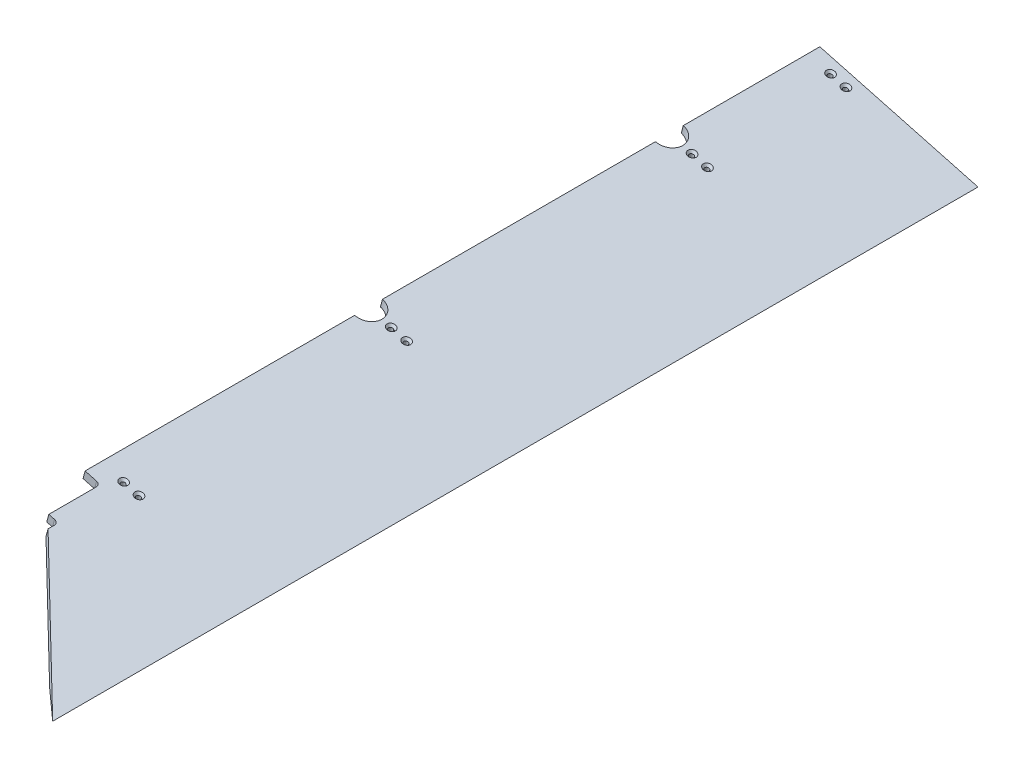
ISO-10303-21;
HEADER;
FILE_DESCRIPTION(('STEP AP214'),'2;1');
FILE_NAME('part.step','',(''),(''),'','','');
FILE_SCHEMA(('AUTOMOTIVE_DESIGN { 1 0 10303 214 1 1 1 1 }'));
ENDSEC;
DATA;
#1=APPLICATION_CONTEXT('core data for automotive mechanical design processes');
#2=APPLICATION_PROTOCOL_DEFINITION('international standard','automotive_design',2000,#1);
#3=PRODUCT_CONTEXT('',#1,'mechanical');
#4=PRODUCT('Part','Part','',(#3));
#5=PRODUCT_RELATED_PRODUCT_CATEGORY('part','',(#4));
#6=PRODUCT_DEFINITION_FORMATION('','',#4);
#7=PRODUCT_DEFINITION_CONTEXT('part definition',#1,'design');
#8=PRODUCT_DEFINITION('design','',#6,#7);
#9=PRODUCT_DEFINITION_SHAPE('','',#8);
#10=(LENGTH_UNIT() NAMED_UNIT(*) SI_UNIT(.MILLI.,.METRE.));
#11=(NAMED_UNIT(*) PLANE_ANGLE_UNIT() SI_UNIT($,.RADIAN.));
#12=(NAMED_UNIT(*) SI_UNIT($,.STERADIAN.) SOLID_ANGLE_UNIT());
#13=UNCERTAINTY_MEASURE_WITH_UNIT(LENGTH_MEASURE(1.E-05),#10,'distance_accuracy_value','');
#14=(GEOMETRIC_REPRESENTATION_CONTEXT(3) GLOBAL_UNCERTAINTY_ASSIGNED_CONTEXT((#13)) GLOBAL_UNIT_ASSIGNED_CONTEXT((#10,
#11,#12)) REPRESENTATION_CONTEXT('',''));
#15=CARTESIAN_POINT('',(0.,0.,0.));
#16=DIRECTION('',(0.,0.,1.));
#17=DIRECTION('',(1.,0.,0.));
#18=AXIS2_PLACEMENT_3D('',#15,#16,#17);
#19=CARTESIAN_POINT('',(25.512001872802,67.770934414059,1479.55));
#20=DIRECTION('',(0.965925826289067,-0.258819045102524,0.));
#21=DIRECTION('',(0.258819045102524,0.965925826289068,0.));
#22=AXIS2_PLACEMENT_3D('',#19,#20,#21);
#23=PLANE('',#22);
#24=DIRECTION('',(0.,0.,-1.));
#25=VECTOR('',#24,1.);
#26=CARTESIAN_POINT('',(22.225,55.5036764201878,1479.55));
#27=LINE('',#26,#25);
#28=CARTESIAN_POINT('',(22.225,55.5036764201878,218.28125));
#29=VERTEX_POINT('',#28);
#30=CARTESIAN_POINT('',(22.225,55.5036764201878,0.));
#31=VERTEX_POINT('',#30);
#32=EDGE_CURVE('E274',#29,#31,#27,.T.);
#33=ORIENTED_EDGE('',*,*,#32,.F.);
#34=DIRECTION('',(0.258819045102524,0.965925826289067,0.));
#35=VECTOR('',#34,1.);
#36=CARTESIAN_POINT('',(8.34908089495289,3.71804131843699,218.28125));
#37=LINE('',#36,#35);
#38=CARTESIAN_POINT('',(25.5120018728021,67.770934414059,218.28125));
#39=VERTEX_POINT('',#38);
#40=EDGE_CURVE('E196',#29,#39,#37,.T.);
#41=ORIENTED_EDGE('',*,*,#40,.T.);
#42=DIRECTION('',(0.,0.,-1.));
#43=VECTOR('',#42,1.);
#44=CARTESIAN_POINT('',(25.512001872802,67.770934414059,1479.55));
#45=LINE('',#44,#43);
#46=CARTESIAN_POINT('',(25.512001872802,67.770934414059,0.));
#47=VERTEX_POINT('',#46);
#48=EDGE_CURVE('E266',#39,#47,#45,.T.);
#49=ORIENTED_EDGE('',*,*,#48,.T.);
#50=DIRECTION('',(-0.258819045102524,-0.965925826289068,0.));
#51=VECTOR('',#50,1.);
#52=CARTESIAN_POINT('',(25.512001872802,67.770934414059,0.));
#53=LINE('',#52,#51);
#54=EDGE_CURVE('E255',#47,#31,#53,.T.);
#55=ORIENTED_EDGE('',*,*,#54,.T.);
#56=EDGE_LOOP('',(#33,#41,#49,#55));
#57=FACE_BOUND('',#56,.T.);
#58=ADVANCED_FACE('F35',(#57),#23,.F.);
#59=CARTESIAN_POINT('',(25.5120018728021,67.770934414059,699.29375));
#60=VERTEX_POINT('',#59);
#61=CARTESIAN_POINT('',(25.512001872802,67.770934414059,262.73125));
#62=VERTEX_POINT('',#61);
#63=EDGE_CURVE('E270',#60,#62,#45,.T.);
#64=ORIENTED_EDGE('',*,*,#63,.T.);
#65=DIRECTION('',(0.258819045102524,0.965925826289067,0.));
#66=VECTOR('',#65,1.);
#67=CARTESIAN_POINT('',(8.34908089495289,3.71804131843699,262.73125));
#68=LINE('',#67,#66);
#69=CARTESIAN_POINT('',(22.225,55.5036764201878,262.73125));
#70=VERTEX_POINT('',#69);
#71=EDGE_CURVE('E193',#62,#70,#68,.F.);
#72=ORIENTED_EDGE('',*,*,#71,.T.);
#73=CARTESIAN_POINT('',(22.225,55.5036764201878,699.29375));
#74=VERTEX_POINT('',#73);
#75=EDGE_CURVE('E278',#74,#70,#27,.T.);
#76=ORIENTED_EDGE('',*,*,#75,.F.);
#77=DIRECTION('',(0.258819045102524,0.965925826289067,0.));
#78=VECTOR('',#77,1.);
#79=CARTESIAN_POINT('',(8.34908089495289,3.718041318437,699.29375));
#80=LINE('',#79,#78);
#81=EDGE_CURVE('E187',#74,#60,#80,.T.);
#82=ORIENTED_EDGE('',*,*,#81,.T.);
#83=EDGE_LOOP('',(#64,#72,#76,#82));
#84=FACE_BOUND('',#83,.T.);
#85=ADVANCED_FACE('F346',(#84),#23,.F.);
#86=CARTESIAN_POINT('',(22.225,55.5036764201878,1174.75));
#87=VERTEX_POINT('',#86);
#88=CARTESIAN_POINT('',(22.225,55.5036764201878,743.74375));
#89=VERTEX_POINT('',#88);
#90=EDGE_CURVE('E275',#87,#89,#27,.T.);
#91=ORIENTED_EDGE('',*,*,#90,.F.);
#92=DIRECTION('',(0.258819045102524,0.965925826289067,0.));
#93=VECTOR('',#92,1.);
#94=CARTESIAN_POINT('',(8.34908089495287,3.71804131843699,1174.75));
#95=LINE('',#94,#93);
#96=CARTESIAN_POINT('',(25.5120018728021,67.770934414059,1174.75));
#97=VERTEX_POINT('',#96);
#98=EDGE_CURVE('E161',#87,#97,#95,.T.);
#99=ORIENTED_EDGE('',*,*,#98,.T.);
#100=CARTESIAN_POINT('',(25.512001872802,67.770934414059,743.74375));
#101=VERTEX_POINT('',#100);
#102=EDGE_CURVE('E267',#97,#101,#45,.T.);
#103=ORIENTED_EDGE('',*,*,#102,.T.);
#104=DIRECTION('',(0.258819045102524,0.965925826289067,0.));
#105=VECTOR('',#104,1.);
#106=CARTESIAN_POINT('',(8.34908089495289,3.718041318437,743.74375));
#107=LINE('',#106,#105);
#108=EDGE_CURVE('E184',#101,#89,#107,.F.);
#109=ORIENTED_EDGE('',*,*,#108,.T.);
#110=EDGE_LOOP('',(#91,#99,#103,#109));
#111=FACE_BOUND('',#110,.T.);
#112=ADVANCED_FACE('F357',(#111),#23,.F.);
#113=CARTESIAN_POINT('',(22.225,55.5036764201878,1479.55));
#114=DIRECTION('',(0.258819045102524,0.965925826289067,0.));
#115=DIRECTION('',(-0.965925826289067,0.258819045102524,0.));
#116=AXIS2_PLACEMENT_3D('',#113,#114,#115);
#117=PLANE('',#116);
#118=CARTESIAN_POINT('',(58.5115491458709,45.7807248804393,721.51875));
#119=DIRECTION('',(0.258819045102524,0.965925826289067,0.));
#120=DIRECTION('',(-0.965925826289067,0.258819045102524,0.));
#121=AXIS2_PLACEMENT_3D('',#118,#119,#120);
#122=CIRCLE('',#121,3.57123999999998);
#123=CARTESIAN_POINT('',(55.0619961979943,46.7050298070713,721.51875));
#124=VERTEX_POINT('',#123);
#125=EDGE_CURVE('E205',#124,#124,#122,.T.);
#126=ORIENTED_EDGE('',*,*,#125,.T.);
#127=EDGE_LOOP('',(#126));
#128=FACE_BOUND('',#127,.T.);
#129=CARTESIAN_POINT('',(83.0460651336132,39.2067211348352,721.51875));
#130=DIRECTION('',(0.258819045102524,0.965925826289067,0.));
#131=DIRECTION('',(-0.965925826289067,0.258819045102524,0.));
#132=AXIS2_PLACEMENT_3D('',#129,#130,#131);
#133=CIRCLE('',#132,3.57123999999998);
#134=CARTESIAN_POINT('',(79.5965121857366,40.1310260614672,721.51875));
#135=VERTEX_POINT('',#134);
#136=EDGE_CURVE('E212',#135,#135,#133,.T.);
#137=ORIENTED_EDGE('',*,*,#136,.T.);
#138=EDGE_LOOP('',(#137));
#139=FACE_BOUND('',#138,.T.);
#140=CARTESIAN_POINT('',(58.5115491458709,45.7807248804393,240.50625));
#141=DIRECTION('',(0.258819045102524,0.965925826289067,0.));
#142=DIRECTION('',(-0.965925826289067,0.258819045102524,0.));
#143=AXIS2_PLACEMENT_3D('',#140,#141,#142);
#144=CIRCLE('',#143,3.57123999999999);
#145=CARTESIAN_POINT('',(55.0619961979943,46.7050298070713,240.50625));
#146=VERTEX_POINT('',#145);
#147=EDGE_CURVE('E219',#146,#146,#144,.T.);
#148=ORIENTED_EDGE('',*,*,#147,.T.);
#149=EDGE_LOOP('',(#148));
#150=FACE_BOUND('',#149,.T.);
#151=CARTESIAN_POINT('',(83.0460651336132,39.2067211348352,240.50625));
#152=DIRECTION('',(0.258819045102524,0.965925826289067,0.));
#153=DIRECTION('',(-0.965925826289067,0.258819045102524,0.));
#154=AXIS2_PLACEMENT_3D('',#151,#152,#153);
#155=CIRCLE('',#154,3.57123999999999);
#156=CARTESIAN_POINT('',(79.5965121857366,40.1310260614672,240.50625));
#157=VERTEX_POINT('',#156);
#158=EDGE_CURVE('E226',#157,#157,#155,.T.);
#159=ORIENTED_EDGE('',*,*,#158,.T.);
#160=EDGE_LOOP('',(#159));
#161=FACE_BOUND('',#160,.T.);
#162=CARTESIAN_POINT('',(58.5115491458709,45.7807248804393,1149.35));
#163=DIRECTION('',(0.258819045102524,0.965925826289067,0.));
#164=DIRECTION('',(-0.965925826289067,0.258819045102524,0.));
#165=AXIS2_PLACEMENT_3D('',#162,#163,#164);
#166=CIRCLE('',#165,3.57124000000009);
#167=CARTESIAN_POINT('',(55.0619961979942,46.7050298070713,1149.35));
#168=VERTEX_POINT('',#167);
#169=EDGE_CURVE('E233',#168,#168,#166,.T.);
#170=ORIENTED_EDGE('',*,*,#169,.T.);
#171=EDGE_LOOP('',(#170));
#172=FACE_BOUND('',#171,.T.);
#173=CARTESIAN_POINT('',(83.0460651336132,39.2067211348352,1149.35));
#174=DIRECTION('',(0.258819045102524,0.965925826289067,0.));
#175=DIRECTION('',(-0.965925826289067,0.258819045102524,0.));
#176=AXIS2_PLACEMENT_3D('',#173,#174,#175);
#177=CIRCLE('',#176,3.57124000000009);
#178=CARTESIAN_POINT('',(79.5965121857365,40.1310260614672,1149.35));
#179=VERTEX_POINT('',#178);
#180=EDGE_CURVE('E240',#179,#179,#177,.T.);
#181=ORIENTED_EDGE('',*,*,#180,.T.);
#182=EDGE_LOOP('',(#181));
#183=FACE_BOUND('',#182,.T.);
#184=CARTESIAN_POINT('',(58.5115491458709,45.7807248804393,19.05));
#185=DIRECTION('',(0.258819045102524,0.965925826289067,0.));
#186=DIRECTION('',(-0.965925826289067,0.258819045102524,0.));
#187=AXIS2_PLACEMENT_3D('',#184,#185,#186);
#188=CIRCLE('',#187,3.57123999999999);
#189=CARTESIAN_POINT('',(55.0619961979943,46.7050298070713,19.05));
#190=VERTEX_POINT('',#189);
#191=EDGE_CURVE('E247',#190,#190,#188,.T.);
#192=ORIENTED_EDGE('',*,*,#191,.T.);
#193=EDGE_LOOP('',(#192));
#194=FACE_BOUND('',#193,.T.);
#195=CARTESIAN_POINT('',(83.0460651336132,39.2067211348352,19.05));
#196=DIRECTION('',(0.258819045102524,0.965925826289067,0.));
#197=DIRECTION('',(-0.965925826289067,0.258819045102524,0.));
#198=AXIS2_PLACEMENT_3D('',#195,#196,#197);
#199=CIRCLE('',#198,3.57123999999999);
#200=CARTESIAN_POINT('',(79.5965121857366,40.1310260614672,19.05));
#201=VERTEX_POINT('',#200);
#202=EDGE_CURVE('E254',#201,#201,#199,.T.);
#203=ORIENTED_EDGE('',*,*,#202,.T.);
#204=EDGE_LOOP('',(#203));
#205=FACE_BOUND('',#204,.T.);
#206=DIRECTION('',(0.,0.,-1.));
#207=VECTOR('',#206,1.);
#208=CARTESIAN_POINT('',(46.7595159877423,48.9296726745837,1479.55));
#209=LINE('',#208,#207);
#210=CARTESIAN_POINT('',(46.7595159877423,48.9296726745837,1257.3));
#211=VERTEX_POINT('',#210);
#212=CARTESIAN_POINT('',(46.7595159877423,48.9296726745837,1181.1));
#213=VERTEX_POINT('',#212);
#214=EDGE_CURVE('E172',#211,#213,#209,.T.);
#215=ORIENTED_EDGE('',*,*,#214,.T.);
#216=CARTESIAN_POINT('',(40.6258869908067,50.5731736109847,1181.1));
#217=DIRECTION('',(0.258819045102524,0.965925826289067,0.));
#218=DIRECTION('',(-0.965925826289067,0.258819045102524,0.));
#219=AXIS2_PLACEMENT_3D('',#216,#217,#218);
#220=CIRCLE('',#219,6.35);
#221=CARTESIAN_POINT('',(40.6258869908067,50.5731736109847,1174.75));
#222=VERTEX_POINT('',#221);
#223=EDGE_CURVE('E305',#213,#222,#220,.T.);
#224=ORIENTED_EDGE('',*,*,#223,.T.);
#225=DIRECTION('',(-0.965925826289067,0.258819045102524,0.));
#226=VECTOR('',#225,1.);
#227=CARTESIAN_POINT('',(22.225,55.5036764201878,1174.75));
#228=LINE('',#227,#226);
#229=EDGE_CURVE('E175',#222,#87,#228,.T.);
#230=ORIENTED_EDGE('',*,*,#229,.T.);
#231=ORIENTED_EDGE('',*,*,#90,.T.);
#232=CARTESIAN_POINT('',(22.225,55.5036764201878,721.51875));
#233=DIRECTION('',(0.258819045102524,0.965925826289067,0.));
#234=DIRECTION('',(-0.965925826289067,0.258819045102524,0.));
#235=AXIS2_PLACEMENT_3D('',#232,#233,#234);
#236=CIRCLE('',#235,22.225);
#237=EDGE_CURVE('E180',#89,#74,#236,.T.);
#238=ORIENTED_EDGE('',*,*,#237,.T.);
#239=ORIENTED_EDGE('',*,*,#75,.T.);
#240=CARTESIAN_POINT('',(22.225,55.5036764201878,240.50625));
#241=DIRECTION('',(0.258819045102524,0.965925826289067,0.));
#242=DIRECTION('',(-0.965925826289067,0.258819045102524,0.));
#243=AXIS2_PLACEMENT_3D('',#240,#241,#242);
#244=CIRCLE('',#243,22.225);
#245=EDGE_CURVE('E190',#70,#29,#244,.T.);
#246=ORIENTED_EDGE('',*,*,#245,.T.);
#247=ORIENTED_EDGE('',*,*,#32,.T.);
#248=DIRECTION('',(0.965925826289067,-0.258819045102524,0.));
#249=VECTOR('',#248,1.);
#250=CARTESIAN_POINT('',(22.225,55.5036764201878,0.));
#251=LINE('',#250,#249);
#252=CARTESIAN_POINT('',(229.367540407001,0.,0.));
#253=VERTEX_POINT('',#252);
#254=EDGE_CURVE('E258',#31,#253,#251,.T.);
#255=ORIENTED_EDGE('',*,*,#254,.T.);
#256=DIRECTION('',(0.,0.,-1.));
#257=VECTOR('',#256,1.);
#258=CARTESIAN_POINT('',(229.367540407001,0.,1479.55));
#259=LINE('',#258,#257);
#260=CARTESIAN_POINT('',(229.367540407001,0.,1435.35154026031));
#261=VERTEX_POINT('',#260);
#262=EDGE_CURVE('E272',#261,#253,#259,.T.);
#263=ORIENTED_EDGE('',*,*,#262,.F.);
#264=DIRECTION('',(-0.706433428546067,0.189288266685271,-0.681998360062496));
#265=VECTOR('',#264,1.);
#266=CARTESIAN_POINT('',(139.865722173839,23.9819399166931,1348.9455311573));
#267=LINE('',#266,#265);
#268=CARTESIAN_POINT('',(62.0935884800813,44.8209203335811,1273.8634845066));
#269=VERTEX_POINT('',#268);
#270=EDGE_CURVE('E167',#261,#269,#267,.T.);
#271=ORIENTED_EDGE('',*,*,#270,.T.);
#272=DIRECTION('',(0.,0.,-1.));
#273=VECTOR('',#272,1.);
#274=CARTESIAN_POINT('',(62.0935884800813,44.8209203335811,1479.55));
#275=LINE('',#274,#273);
#276=CARTESIAN_POINT('',(62.0935884800813,44.8209203335811,1263.65));
#277=VERTEX_POINT('',#276);
#278=EDGE_CURVE('E137',#269,#277,#275,.T.);
#279=ORIENTED_EDGE('',*,*,#278,.T.);
#280=CARTESIAN_POINT('',(55.9599594831457,46.4644212699822,1263.65));
#281=DIRECTION('',(0.258819045102524,0.965925826289067,0.));
#282=DIRECTION('',(-0.965925826289067,0.258819045102524,0.));
#283=AXIS2_PLACEMENT_3D('',#280,#281,#282);
#284=CIRCLE('',#283,6.35);
#285=CARTESIAN_POINT('',(55.9599594831457,46.4644212699822,1257.3));
#286=VERTEX_POINT('',#285);
#287=EDGE_CURVE('E11',#277,#286,#284,.T.);
#288=ORIENTED_EDGE('',*,*,#287,.T.);
#289=DIRECTION('',(-0.965925826289067,0.258819045102524,0.));
#290=VECTOR('',#289,1.);
#291=CARTESIAN_POINT('',(22.225,55.5036764201878,1257.3));
#292=LINE('',#291,#290);
#293=EDGE_CURVE('E170',#286,#211,#292,.T.);
#294=ORIENTED_EDGE('',*,*,#293,.T.);
#295=EDGE_LOOP('',(#215,#224,#230,#231,#238,#239,#246,#247,#255,#263,#271,#279,#288,#294));
#296=FACE_BOUND('',#295,.T.);
#297=ADVANCED_FACE('F309',(#128,#139,#150,#161,#172,#183,#194,#205,#296),#117,.F.);
#298=CARTESIAN_POINT('',(229.367540407001,0.,1479.55));
#299=DIRECTION('',(0.,1.,0.));
#300=DIRECTION('',(0.,0.,1.));
#301=AXIS2_PLACEMENT_3D('',#298,#299,#300);
#302=PLANE('',#301);
#303=DIRECTION('',(0.,0.,-1.));
#304=VECTOR('',#303,1.);
#305=CARTESIAN_POINT('',(278.436572382485,0.,1479.55));
#306=LINE('',#305,#304);
#307=CARTESIAN_POINT('',(278.436572382485,0.,1479.55));
#308=VERTEX_POINT('',#307);
#309=CARTESIAN_POINT('',(278.436572382485,0.,0.));
#310=VERTEX_POINT('',#309);
#311=EDGE_CURVE('E269',#308,#310,#306,.T.);
#312=ORIENTED_EDGE('',*,*,#311,.F.);
#313=DIRECTION('',(-0.743020535718653,0.,-0.669268618344209));
#314=VECTOR('',#313,1.);
#315=CARTESIAN_POINT('',(251.346564934355,0.,1455.14893571689));
#316=LINE('',#315,#314);
#317=EDGE_CURVE('E147',#308,#261,#316,.T.);
#318=ORIENTED_EDGE('',*,*,#317,.T.);
#319=ORIENTED_EDGE('',*,*,#262,.T.);
#320=DIRECTION('',(1.,0.,0.));
#321=VECTOR('',#320,1.);
#322=CARTESIAN_POINT('',(229.367540407001,0.,0.));
#323=LINE('',#322,#321);
#324=EDGE_CURVE('E261',#253,#310,#323,.T.);
#325=ORIENTED_EDGE('',*,*,#324,.T.);
#326=EDGE_LOOP('',(#312,#318,#319,#325));
#327=FACE_BOUND('',#326,.T.);
#328=ADVANCED_FACE('F332',(#327),#302,.F.);
#329=CARTESIAN_POINT('',(278.436572382485,0.,1479.55));
#330=DIRECTION('',(-0.258819045102524,-0.965925826289067,0.));
#331=DIRECTION('',(0.965925826289068,-0.258819045102524,0.));
#332=AXIS2_PLACEMENT_3D('',#329,#330,#331);
#333=PLANE('',#332);
#334=CARTESIAN_POINT('',(61.7985510186729,58.0479828743105,721.51875));
#335=DIRECTION('',(0.258819045102524,0.965925826289068,0.));
#336=DIRECTION('',(-0.965925826289068,0.258819045102524,0.));
#337=AXIS2_PLACEMENT_3D('',#334,#335,#336);
#338=CIRCLE('',#337,6.74370000000002);
#339=CARTESIAN_POINT('',(55.2846370239273,59.7933808687684,721.51875));
#340=VERTEX_POINT('',#339);
#341=EDGE_CURVE('E199',#340,#340,#338,.T.);
#342=ORIENTED_EDGE('',*,*,#341,.F.);
#343=EDGE_LOOP('',(#342));
#344=FACE_BOUND('',#343,.T.);
#345=CARTESIAN_POINT('',(86.3330670064153,51.4739791287064,721.51875));
#346=DIRECTION('',(0.258819045102524,0.965925826289068,0.));
#347=DIRECTION('',(-0.965925826289068,0.258819045102524,0.));
#348=AXIS2_PLACEMENT_3D('',#345,#346,#347);
#349=CIRCLE('',#348,6.74370000000002);
#350=CARTESIAN_POINT('',(79.8191530116697,53.2193771231643,721.51875));
#351=VERTEX_POINT('',#350);
#352=EDGE_CURVE('E206',#351,#351,#349,.T.);
#353=ORIENTED_EDGE('',*,*,#352,.F.);
#354=EDGE_LOOP('',(#353));
#355=FACE_BOUND('',#354,.T.);
#356=CARTESIAN_POINT('',(61.7985510186729,58.0479828743105,240.50625));
#357=DIRECTION('',(0.258819045102524,0.965925826289068,0.));
#358=DIRECTION('',(-0.965925826289068,0.258819045102524,0.));
#359=AXIS2_PLACEMENT_3D('',#356,#357,#358);
#360=CIRCLE('',#359,6.74369999999999);
#361=CARTESIAN_POINT('',(55.2846370239274,59.7933808687684,240.50625));
#362=VERTEX_POINT('',#361);
#363=EDGE_CURVE('E213',#362,#362,#360,.T.);
#364=ORIENTED_EDGE('',*,*,#363,.F.);
#365=EDGE_LOOP('',(#364));
#366=FACE_BOUND('',#365,.T.);
#367=CARTESIAN_POINT('',(86.3330670064153,51.4739791287064,240.50625));
#368=DIRECTION('',(0.258819045102524,0.965925826289068,0.));
#369=DIRECTION('',(-0.965925826289068,0.258819045102524,0.));
#370=AXIS2_PLACEMENT_3D('',#367,#368,#369);
#371=CIRCLE('',#370,6.74369999999999);
#372=CARTESIAN_POINT('',(79.8191530116697,53.2193771231643,240.50625));
#373=VERTEX_POINT('',#372);
#374=EDGE_CURVE('E220',#373,#373,#371,.T.);
#375=ORIENTED_EDGE('',*,*,#374,.F.);
#376=EDGE_LOOP('',(#375));
#377=FACE_BOUND('',#376,.T.);
#378=CARTESIAN_POINT('',(61.798551018673,58.0479828743105,1149.35));
#379=DIRECTION('',(0.258819045102524,0.965925826289068,0.));
#380=DIRECTION('',(-0.965925826289068,0.258819045102524,0.));
#381=AXIS2_PLACEMENT_3D('',#378,#379,#380);
#382=CIRCLE('',#381,6.74369999999991);
#383=CARTESIAN_POINT('',(55.2846370239275,59.7933808687684,1149.35));
#384=VERTEX_POINT('',#383);
#385=EDGE_CURVE('E227',#384,#384,#382,.T.);
#386=ORIENTED_EDGE('',*,*,#385,.F.);
#387=EDGE_LOOP('',(#386));
#388=FACE_BOUND('',#387,.T.);
#389=CARTESIAN_POINT('',(86.3330670064153,51.4739791287064,1149.35));
#390=DIRECTION('',(0.258819045102524,0.965925826289068,0.));
#391=DIRECTION('',(-0.965925826289068,0.258819045102524,0.));
#392=AXIS2_PLACEMENT_3D('',#389,#390,#391);
#393=CIRCLE('',#392,6.74369999999991);
#394=CARTESIAN_POINT('',(79.8191530116698,53.2193771231643,1149.35));
#395=VERTEX_POINT('',#394);
#396=EDGE_CURVE('E234',#395,#395,#393,.T.);
#397=ORIENTED_EDGE('',*,*,#396,.F.);
#398=EDGE_LOOP('',(#397));
#399=FACE_BOUND('',#398,.T.);
#400=CARTESIAN_POINT('',(61.798551018673,58.0479828743105,19.05));
#401=DIRECTION('',(0.258819045102524,0.965925826289068,0.));
#402=DIRECTION('',(-0.965925826289068,0.258819045102524,0.));
#403=AXIS2_PLACEMENT_3D('',#400,#401,#402);
#404=CIRCLE('',#403,6.7437);
#405=CARTESIAN_POINT('',(55.2846370239274,59.7933808687684,19.05));
#406=VERTEX_POINT('',#405);
#407=EDGE_CURVE('E241',#406,#406,#404,.T.);
#408=ORIENTED_EDGE('',*,*,#407,.F.);
#409=EDGE_LOOP('',(#408));
#410=FACE_BOUND('',#409,.T.);
#411=CARTESIAN_POINT('',(86.3330670064153,51.4739791287064,19.05));
#412=DIRECTION('',(0.258819045102524,0.965925826289068,0.));
#413=DIRECTION('',(-0.965925826289068,0.258819045102524,0.));
#414=AXIS2_PLACEMENT_3D('',#411,#412,#413);
#415=CIRCLE('',#414,6.7437);
#416=CARTESIAN_POINT('',(79.8191530116697,53.2193771231643,19.05));
#417=VERTEX_POINT('',#416);
#418=EDGE_CURVE('E248',#417,#417,#415,.T.);
#419=ORIENTED_EDGE('',*,*,#418,.F.);
#420=EDGE_LOOP('',(#419));
#421=FACE_BOUND('',#420,.T.);
#422=ORIENTED_EDGE('',*,*,#102,.F.);
#423=DIRECTION('',(-0.965925826289067,0.258819045102524,0.));
#424=VECTOR('',#423,1.);
#425=CARTESIAN_POINT('',(50.0465178605444,61.1969306684549,1174.75));
#426=LINE('',#425,#424);
#427=CARTESIAN_POINT('',(43.9128888636088,62.8404316048559,1174.75));
#428=VERTEX_POINT('',#427);
#429=EDGE_CURVE('E141',#428,#97,#426,.T.);
#430=ORIENTED_EDGE('',*,*,#429,.F.);
#431=CARTESIAN_POINT('',(43.9128888636088,62.8404316048559,1181.1));
#432=DIRECTION('',(-0.258819045102524,-0.965925826289067,0.));
#433=DIRECTION('',(0.965925826289068,-0.258819045102524,0.));
#434=AXIS2_PLACEMENT_3D('',#431,#432,#433);
#435=CIRCLE('',#434,6.35);
#436=CARTESIAN_POINT('',(50.0465178605444,61.1969306684549,1181.1));
#437=VERTEX_POINT('',#436);
#438=EDGE_CURVE('E303',#428,#437,#435,.T.);
#439=ORIENTED_EDGE('',*,*,#438,.T.);
#440=DIRECTION('',(0.,0.,-1.));
#441=VECTOR('',#440,1.);
#442=CARTESIAN_POINT('',(50.0465178605444,61.1969306684549,1257.3));
#443=LINE('',#442,#441);
#444=CARTESIAN_POINT('',(50.0465178605444,61.1969306684549,1257.3));
#445=VERTEX_POINT('',#444);
#446=EDGE_CURVE('E155',#445,#437,#443,.T.);
#447=ORIENTED_EDGE('',*,*,#446,.F.);
#448=DIRECTION('',(-0.965925826289067,0.258819045102524,0.));
#449=VECTOR('',#448,1.);
#450=CARTESIAN_POINT('',(65.3805903528833,57.0881783274523,1257.3));
#451=LINE('',#450,#449);
#452=CARTESIAN_POINT('',(59.2469613559478,58.7316792638534,1257.3));
#453=VERTEX_POINT('',#452);
#454=EDGE_CURVE('E153',#453,#445,#451,.T.);
#455=ORIENTED_EDGE('',*,*,#454,.F.);
#456=CARTESIAN_POINT('',(59.2469613559478,58.7316792638533,1263.65));
#457=DIRECTION('',(-0.258819045102524,-0.965925826289067,0.));
#458=DIRECTION('',(0.965925826289068,-0.258819045102524,0.));
#459=AXIS2_PLACEMENT_3D('',#456,#457,#458);
#460=CIRCLE('',#459,6.35);
#461=CARTESIAN_POINT('',(65.3805903528833,57.0881783274523,1263.65));
#462=VERTEX_POINT('',#461);
#463=EDGE_CURVE('E43',#453,#462,#460,.T.);
#464=ORIENTED_EDGE('',*,*,#463,.T.);
#465=DIRECTION('',(0.,0.,-1.));
#466=VECTOR('',#465,1.);
#467=CARTESIAN_POINT('',(65.3805903528833,57.0881783274523,1273.8634845066));
#468=LINE('',#467,#466);
#469=CARTESIAN_POINT('',(65.3805903528833,57.0881783274523,1273.8634845066));
#470=VERTEX_POINT('',#469);
#471=EDGE_CURVE('E136',#470,#462,#468,.T.);
#472=ORIENTED_EDGE('',*,*,#471,.F.);
#473=DIRECTION('',(-0.706433428546067,0.18928826668527,-0.681998360062496));
#474=VECTOR('',#473,1.);
#475=CARTESIAN_POINT('',(278.436572382485,0.,1479.55));
#476=LINE('',#475,#474);
#477=EDGE_CURVE('E144',#308,#470,#476,.T.);
#478=ORIENTED_EDGE('',*,*,#477,.F.);
#479=ORIENTED_EDGE('',*,*,#311,.T.);
#480=DIRECTION('',(-0.965925826289068,0.258819045102524,0.));
#481=VECTOR('',#480,1.);
#482=CARTESIAN_POINT('',(278.436572382485,0.,0.));
#483=LINE('',#482,#481);
#484=EDGE_CURVE('E263',#310,#47,#483,.T.);
#485=ORIENTED_EDGE('',*,*,#484,.T.);
#486=ORIENTED_EDGE('',*,*,#48,.F.);
#487=CARTESIAN_POINT('',(25.512001872802,67.770934414059,240.50625));
#488=DIRECTION('',(0.258819045102524,0.965925826289068,0.));
#489=DIRECTION('',(-0.965925826289068,0.258819045102524,0.));
#490=AXIS2_PLACEMENT_3D('',#487,#488,#489);
#491=CIRCLE('',#490,22.225);
#492=EDGE_CURVE('E178',#62,#39,#491,.T.);
#493=ORIENTED_EDGE('',*,*,#492,.F.);
#494=ORIENTED_EDGE('',*,*,#63,.F.);
#495=CARTESIAN_POINT('',(25.5120018728021,67.770934414059,721.51875));
#496=DIRECTION('',(0.258819045102524,0.965925826289068,0.));
#497=DIRECTION('',(-0.965925826289068,0.258819045102524,0.));
#498=AXIS2_PLACEMENT_3D('',#495,#496,#497);
#499=CIRCLE('',#498,22.225);
#500=EDGE_CURVE('E177',#101,#60,#499,.T.);
#501=ORIENTED_EDGE('',*,*,#500,.F.);
#502=EDGE_LOOP('',(#422,#430,#439,#447,#455,#464,#472,#478,#479,#485,#486,#493,#494,#501));
#503=FACE_BOUND('',#502,.T.);
#504=ADVANCED_FACE('F152',(#344,#355,#366,#377,#388,#399,#410,#421,#503),#333,.F.);
#505=CARTESIAN_POINT('',(0.,0.,0.));
#506=DIRECTION('',(0.,0.,1.));
#507=DIRECTION('',(1.,0.,0.));
#508=AXIS2_PLACEMENT_3D('',#505,#506,#507);
#509=PLANE('',#508);
#510=ORIENTED_EDGE('',*,*,#54,.F.);
#511=ORIENTED_EDGE('',*,*,#484,.F.);
#512=ORIENTED_EDGE('',*,*,#324,.F.);
#513=ORIENTED_EDGE('',*,*,#254,.F.);
#514=EDGE_LOOP('',(#510,#511,#512,#513));
#515=FACE_BOUND('',#514,.T.);
#516=ADVANCED_FACE('F338',(#515),#509,.F.);
#517=CARTESIAN_POINT('',(86.3330670064153,51.4739791287064,19.05));
#518=DIRECTION('',(0.258819045102524,0.965925826289068,0.));
#519=DIRECTION('',(-0.965925826289068,0.258819045102524,0.));
#520=AXIS2_PLACEMENT_3D('',#517,#518,#519);
#521=CYLINDRICAL_SURFACE('',#520,3.57123999999999);
#522=CARTESIAN_POINT('',(85.3885074818001,47.9488349920696,19.05));
#523=DIRECTION('',(0.258819045102524,0.965925826289068,0.));
#524=DIRECTION('',(-0.965925826289068,0.258819045102524,0.));
#525=AXIS2_PLACEMENT_3D('',#522,#523,#524);
#526=CIRCLE('',#525,3.57124);
#527=CARTESIAN_POINT('',(81.9389545339235,48.8731399187016,19.05));
#528=VERTEX_POINT('',#527);
#529=EDGE_CURVE('E251',#528,#528,#526,.T.);
#530=ORIENTED_EDGE('',*,*,#529,.T.);
#531=EDGE_LOOP('',(#530));
#532=FACE_BOUND('',#531,.T.);
#533=ORIENTED_EDGE('',*,*,#202,.F.);
#534=EDGE_LOOP('',(#533));
#535=FACE_BOUND('',#534,.T.);
#536=ADVANCED_FACE('F538',(#532,#535),#521,.F.);
#537=CARTESIAN_POINT('',(86.3330670064153,51.4739791287064,19.05));
#538=DIRECTION('',(0.258819045102524,0.965925826289068,0.));
#539=DIRECTION('',(-0.965925826289068,0.258819045102524,0.));
#540=AXIS2_PLACEMENT_3D('',#537,#538,#539);
#541=CONICAL_SURFACE('',#540,6.7437,0.715584993317675);
#542=ORIENTED_EDGE('',*,*,#529,.F.);
#543=EDGE_LOOP('',(#542));
#544=FACE_BOUND('',#543,.T.);
#545=ORIENTED_EDGE('',*,*,#418,.T.);
#546=EDGE_LOOP('',(#545));
#547=FACE_BOUND('',#546,.T.);
#548=ADVANCED_FACE('F534',(#544,#547),#541,.F.);
#549=CARTESIAN_POINT('',(61.798551018673,58.0479828743105,19.05));
#550=DIRECTION('',(0.258819045102524,0.965925826289068,0.));
#551=DIRECTION('',(-0.965925826289068,0.258819045102524,0.));
#552=AXIS2_PLACEMENT_3D('',#549,#550,#551);
#553=CYLINDRICAL_SURFACE('',#552,3.57123999999999);
#554=CARTESIAN_POINT('',(60.8539914940578,54.5228387376737,19.05));
#555=DIRECTION('',(0.258819045102524,0.965925826289068,0.));
#556=DIRECTION('',(-0.965925826289068,0.258819045102524,0.));
#557=AXIS2_PLACEMENT_3D('',#554,#555,#556);
#558=CIRCLE('',#557,3.57124);
#559=CARTESIAN_POINT('',(57.4044385461812,55.4471436643057,19.05));
#560=VERTEX_POINT('',#559);
#561=EDGE_CURVE('E244',#560,#560,#558,.T.);
#562=ORIENTED_EDGE('',*,*,#561,.T.);
#563=EDGE_LOOP('',(#562));
#564=FACE_BOUND('',#563,.T.);
#565=ORIENTED_EDGE('',*,*,#191,.F.);
#566=EDGE_LOOP('',(#565));
#567=FACE_BOUND('',#566,.T.);
#568=ADVANCED_FACE('F530',(#564,#567),#553,.F.);
#569=CARTESIAN_POINT('',(61.798551018673,58.0479828743105,19.05));
#570=DIRECTION('',(0.258819045102524,0.965925826289068,0.));
#571=DIRECTION('',(-0.965925826289068,0.258819045102524,0.));
#572=AXIS2_PLACEMENT_3D('',#569,#570,#571);
#573=CONICAL_SURFACE('',#572,6.7437,0.715584993317675);
#574=ORIENTED_EDGE('',*,*,#561,.F.);
#575=EDGE_LOOP('',(#574));
#576=FACE_BOUND('',#575,.T.);
#577=ORIENTED_EDGE('',*,*,#407,.T.);
#578=EDGE_LOOP('',(#577));
#579=FACE_BOUND('',#578,.T.);
#580=ADVANCED_FACE('F526',(#576,#579),#573,.F.);
#581=CARTESIAN_POINT('',(86.3330670064153,51.4739791287064,1149.35));
#582=DIRECTION('',(0.258819045102524,0.965925826289068,0.));
#583=DIRECTION('',(-0.965925826289068,0.258819045102524,0.));
#584=AXIS2_PLACEMENT_3D('',#581,#582,#583);
#585=CYLINDRICAL_SURFACE('',#584,3.57124000000009);
#586=CARTESIAN_POINT('',(85.3885074818001,47.9488349920696,1149.35));
#587=DIRECTION('',(0.258819045102524,0.965925826289068,0.));
#588=DIRECTION('',(-0.965925826289068,0.258819045102524,0.));
#589=AXIS2_PLACEMENT_3D('',#586,#587,#588);
#590=CIRCLE('',#589,3.57124000000009);
#591=CARTESIAN_POINT('',(81.9389545339235,48.8731399187016,1149.35));
#592=VERTEX_POINT('',#591);
#593=EDGE_CURVE('E237',#592,#592,#590,.T.);
#594=ORIENTED_EDGE('',*,*,#593,.T.);
#595=EDGE_LOOP('',(#594));
#596=FACE_BOUND('',#595,.T.);
#597=ORIENTED_EDGE('',*,*,#180,.F.);
#598=EDGE_LOOP('',(#597));
#599=FACE_BOUND('',#598,.T.);
#600=ADVANCED_FACE('F522',(#596,#599),#585,.F.);
#601=CARTESIAN_POINT('',(86.3330670064153,51.4739791287064,1149.35));
#602=DIRECTION('',(0.258819045102524,0.965925826289068,0.));
#603=DIRECTION('',(-0.965925826289068,0.258819045102524,0.));
#604=AXIS2_PLACEMENT_3D('',#601,#602,#603);
#605=CONICAL_SURFACE('',#604,6.74369999999991,0.715584993317647);
#606=ORIENTED_EDGE('',*,*,#593,.F.);
#607=EDGE_LOOP('',(#606));
#608=FACE_BOUND('',#607,.T.);
#609=ORIENTED_EDGE('',*,*,#396,.T.);
#610=EDGE_LOOP('',(#609));
#611=FACE_BOUND('',#610,.T.);
#612=ADVANCED_FACE('F518',(#608,#611),#605,.F.);
#613=CARTESIAN_POINT('',(61.798551018673,58.0479828743105,1149.35));
#614=DIRECTION('',(0.258819045102524,0.965925826289068,0.));
#615=DIRECTION('',(-0.965925826289068,0.258819045102524,0.));
#616=AXIS2_PLACEMENT_3D('',#613,#614,#615);
#617=CYLINDRICAL_SURFACE('',#616,3.57124000000009);
#618=CARTESIAN_POINT('',(60.8539914940578,54.5228387376737,1149.35));
#619=DIRECTION('',(0.258819045102524,0.965925826289068,0.));
#620=DIRECTION('',(-0.965925826289068,0.258819045102524,0.));
#621=AXIS2_PLACEMENT_3D('',#618,#619,#620);
#622=CIRCLE('',#621,3.57124000000009);
#623=CARTESIAN_POINT('',(57.4044385461811,55.4471436643057,1149.35));
#624=VERTEX_POINT('',#623);
#625=EDGE_CURVE('E230',#624,#624,#622,.T.);
#626=ORIENTED_EDGE('',*,*,#625,.T.);
#627=EDGE_LOOP('',(#626));
#628=FACE_BOUND('',#627,.T.);
#629=ORIENTED_EDGE('',*,*,#169,.F.);
#630=EDGE_LOOP('',(#629));
#631=FACE_BOUND('',#630,.T.);
#632=ADVANCED_FACE('F514',(#628,#631),#617,.F.);
#633=CARTESIAN_POINT('',(61.798551018673,58.0479828743105,1149.35));
#634=DIRECTION('',(0.258819045102524,0.965925826289068,0.));
#635=DIRECTION('',(-0.965925826289068,0.258819045102524,0.));
#636=AXIS2_PLACEMENT_3D('',#633,#634,#635);
#637=CONICAL_SURFACE('',#636,6.74369999999991,0.715584993317647);
#638=ORIENTED_EDGE('',*,*,#625,.F.);
#639=EDGE_LOOP('',(#638));
#640=FACE_BOUND('',#639,.T.);
#641=ORIENTED_EDGE('',*,*,#385,.T.);
#642=EDGE_LOOP('',(#641));
#643=FACE_BOUND('',#642,.T.);
#644=ADVANCED_FACE('F510',(#640,#643),#637,.F.);
#645=CARTESIAN_POINT('',(86.3330670064153,51.4739791287064,240.50625));
#646=DIRECTION('',(0.258819045102524,0.965925826289068,0.));
#647=DIRECTION('',(-0.965925826289068,0.258819045102524,0.));
#648=AXIS2_PLACEMENT_3D('',#645,#646,#647);
#649=CYLINDRICAL_SURFACE('',#648,3.57123999999999);
#650=CARTESIAN_POINT('',(85.3885074818001,47.9488349920696,240.50625));
#651=DIRECTION('',(0.258819045102524,0.965925826289068,0.));
#652=DIRECTION('',(-0.965925826289068,0.258819045102524,0.));
#653=AXIS2_PLACEMENT_3D('',#650,#651,#652);
#654=CIRCLE('',#653,3.57124);
#655=CARTESIAN_POINT('',(81.9389545339235,48.8731399187016,240.50625));
#656=VERTEX_POINT('',#655);
#657=EDGE_CURVE('E223',#656,#656,#654,.T.);
#658=ORIENTED_EDGE('',*,*,#657,.T.);
#659=EDGE_LOOP('',(#658));
#660=FACE_BOUND('',#659,.T.);
#661=ORIENTED_EDGE('',*,*,#158,.F.);
#662=EDGE_LOOP('',(#661));
#663=FACE_BOUND('',#662,.T.);
#664=ADVANCED_FACE('F506',(#660,#663),#649,.F.);
#665=CARTESIAN_POINT('',(86.3330670064153,51.4739791287064,240.50625));
#666=DIRECTION('',(0.258819045102524,0.965925826289068,0.));
#667=DIRECTION('',(-0.965925826289068,0.258819045102524,0.));
#668=AXIS2_PLACEMENT_3D('',#665,#666,#667);
#669=CONICAL_SURFACE('',#668,6.74369999999999,0.715584993317673);
#670=ORIENTED_EDGE('',*,*,#657,.F.);
#671=EDGE_LOOP('',(#670));
#672=FACE_BOUND('',#671,.T.);
#673=ORIENTED_EDGE('',*,*,#374,.T.);
#674=EDGE_LOOP('',(#673));
#675=FACE_BOUND('',#674,.T.);
#676=ADVANCED_FACE('F502',(#672,#675),#669,.F.);
#677=CARTESIAN_POINT('',(61.7985510186729,58.0479828743105,240.50625));
#678=DIRECTION('',(0.258819045102524,0.965925826289068,0.));
#679=DIRECTION('',(-0.965925826289068,0.258819045102524,0.));
#680=AXIS2_PLACEMENT_3D('',#677,#678,#679);
#681=CYLINDRICAL_SURFACE('',#680,3.57123999999999);
#682=CARTESIAN_POINT('',(60.8539914940578,54.5228387376737,240.50625));
#683=DIRECTION('',(0.258819045102524,0.965925826289068,0.));
#684=DIRECTION('',(-0.965925826289068,0.258819045102524,0.));
#685=AXIS2_PLACEMENT_3D('',#682,#683,#684);
#686=CIRCLE('',#685,3.57124);
#687=CARTESIAN_POINT('',(57.4044385461812,55.4471436643057,240.50625));
#688=VERTEX_POINT('',#687);
#689=EDGE_CURVE('E216',#688,#688,#686,.T.);
#690=ORIENTED_EDGE('',*,*,#689,.T.);
#691=EDGE_LOOP('',(#690));
#692=FACE_BOUND('',#691,.T.);
#693=ORIENTED_EDGE('',*,*,#147,.F.);
#694=EDGE_LOOP('',(#693));
#695=FACE_BOUND('',#694,.T.);
#696=ADVANCED_FACE('F498',(#692,#695),#681,.F.);
#697=CARTESIAN_POINT('',(61.7985510186729,58.0479828743105,240.50625));
#698=DIRECTION('',(0.258819045102524,0.965925826289068,0.));
#699=DIRECTION('',(-0.965925826289068,0.258819045102524,0.));
#700=AXIS2_PLACEMENT_3D('',#697,#698,#699);
#701=CONICAL_SURFACE('',#700,6.74369999999999,0.715584993317673);
#702=ORIENTED_EDGE('',*,*,#689,.F.);
#703=EDGE_LOOP('',(#702));
#704=FACE_BOUND('',#703,.T.);
#705=ORIENTED_EDGE('',*,*,#363,.T.);
#706=EDGE_LOOP('',(#705));
#707=FACE_BOUND('',#706,.T.);
#708=ADVANCED_FACE('F494',(#704,#707),#701,.F.);
#709=CARTESIAN_POINT('',(86.3330670064153,51.4739791287064,721.51875));
#710=DIRECTION('',(0.258819045102524,0.965925826289068,0.));
#711=DIRECTION('',(-0.965925826289068,0.258819045102524,0.));
#712=AXIS2_PLACEMENT_3D('',#709,#710,#711);
#713=CYLINDRICAL_SURFACE('',#712,3.57123999999998);
#714=CARTESIAN_POINT('',(85.3885074818001,47.9488349920696,721.51875));
#715=DIRECTION('',(0.258819045102524,0.965925826289068,0.));
#716=DIRECTION('',(-0.965925826289068,0.258819045102524,0.));
#717=AXIS2_PLACEMENT_3D('',#714,#715,#716);
#718=CIRCLE('',#717,3.57123999999998);
#719=CARTESIAN_POINT('',(81.9389545339236,48.8731399187016,721.51875));
#720=VERTEX_POINT('',#719);
#721=EDGE_CURVE('E209',#720,#720,#718,.T.);
#722=ORIENTED_EDGE('',*,*,#721,.T.);
#723=EDGE_LOOP('',(#722));
#724=FACE_BOUND('',#723,.T.);
#725=ORIENTED_EDGE('',*,*,#136,.F.);
#726=EDGE_LOOP('',(#725));
#727=FACE_BOUND('',#726,.T.);
#728=ADVANCED_FACE('F490',(#724,#727),#713,.F.);
#729=CARTESIAN_POINT('',(86.3330670064153,51.4739791287064,721.51875));
#730=DIRECTION('',(0.258819045102524,0.965925826289068,0.));
#731=DIRECTION('',(-0.965925826289068,0.258819045102524,0.));
#732=AXIS2_PLACEMENT_3D('',#729,#730,#731);
#733=CONICAL_SURFACE('',#732,6.74370000000002,0.715584993317682);
#734=ORIENTED_EDGE('',*,*,#721,.F.);
#735=EDGE_LOOP('',(#734));
#736=FACE_BOUND('',#735,.T.);
#737=ORIENTED_EDGE('',*,*,#352,.T.);
#738=EDGE_LOOP('',(#737));
#739=FACE_BOUND('',#738,.T.);
#740=ADVANCED_FACE('F486',(#736,#739),#733,.F.);
#741=CARTESIAN_POINT('',(61.7985510186729,58.0479828743105,721.51875));
#742=DIRECTION('',(0.258819045102524,0.965925826289068,0.));
#743=DIRECTION('',(-0.965925826289068,0.258819045102524,0.));
#744=AXIS2_PLACEMENT_3D('',#741,#742,#743);
#745=CYLINDRICAL_SURFACE('',#744,3.57123999999998);
#746=CARTESIAN_POINT('',(60.8539914940578,54.5228387376737,721.51875));
#747=DIRECTION('',(0.258819045102524,0.965925826289068,0.));
#748=DIRECTION('',(-0.965925826289068,0.258819045102524,0.));
#749=AXIS2_PLACEMENT_3D('',#746,#747,#748);
#750=CIRCLE('',#749,3.57123999999998);
#751=CARTESIAN_POINT('',(57.4044385461812,55.4471436643057,721.51875));
#752=VERTEX_POINT('',#751);
#753=EDGE_CURVE('E202',#752,#752,#750,.T.);
#754=ORIENTED_EDGE('',*,*,#753,.T.);
#755=EDGE_LOOP('',(#754));
#756=FACE_BOUND('',#755,.T.);
#757=ORIENTED_EDGE('',*,*,#125,.F.);
#758=EDGE_LOOP('',(#757));
#759=FACE_BOUND('',#758,.T.);
#760=ADVANCED_FACE('F482',(#756,#759),#745,.F.);
#761=CARTESIAN_POINT('',(61.7985510186729,58.0479828743105,721.51875));
#762=DIRECTION('',(0.258819045102524,0.965925826289068,0.));
#763=DIRECTION('',(-0.965925826289068,0.258819045102524,0.));
#764=AXIS2_PLACEMENT_3D('',#761,#762,#763);
#765=CONICAL_SURFACE('',#764,6.74370000000002,0.715584993317682);
#766=ORIENTED_EDGE('',*,*,#753,.F.);
#767=EDGE_LOOP('',(#766));
#768=FACE_BOUND('',#767,.T.);
#769=ORIENTED_EDGE('',*,*,#341,.T.);
#770=EDGE_LOOP('',(#769));
#771=FACE_BOUND('',#770,.T.);
#772=ADVANCED_FACE('F384',(#768,#771),#765,.F.);
#773=CARTESIAN_POINT('',(8.34908089495287,3.718041318437,721.51875));
#774=DIRECTION('',(0.258819045102524,0.965925826289067,0.));
#775=DIRECTION('',(-0.965925826289068,0.258819045102524,0.));
#776=AXIS2_PLACEMENT_3D('',#773,#774,#775);
#777=CYLINDRICAL_SURFACE('',#776,22.225);
#778=ORIENTED_EDGE('',*,*,#237,.F.);
#779=ORIENTED_EDGE('',*,*,#108,.F.);
#780=ORIENTED_EDGE('',*,*,#500,.T.);
#781=ORIENTED_EDGE('',*,*,#81,.F.);
#782=EDGE_LOOP('',(#778,#779,#780,#781));
#783=FACE_BOUND('',#782,.T.);
#784=ADVANCED_FACE('F355',(#783),#777,.F.);
#785=CARTESIAN_POINT('',(8.34908089495284,3.718041318437,240.50625));
#786=DIRECTION('',(0.258819045102524,0.965925826289067,0.));
#787=DIRECTION('',(-0.965925826289068,0.258819045102524,0.));
#788=AXIS2_PLACEMENT_3D('',#785,#786,#787);
#789=CYLINDRICAL_SURFACE('',#788,22.225);
#790=ORIENTED_EDGE('',*,*,#245,.F.);
#791=ORIENTED_EDGE('',*,*,#71,.F.);
#792=ORIENTED_EDGE('',*,*,#492,.T.);
#793=ORIENTED_EDGE('',*,*,#40,.F.);
#794=EDGE_LOOP('',(#790,#791,#792,#793));
#795=FACE_BOUND('',#794,.T.);
#796=ADVANCED_FACE('F351',(#795),#789,.F.);
#797=CARTESIAN_POINT('',(32.8835968826952,-2.85596242716712,1174.75));
#798=DIRECTION('',(0.,0.,-1.));
#799=DIRECTION('',(-1.,0.,0.));
#800=AXIS2_PLACEMENT_3D('',#797,#798,#799);
#801=PLANE('',#800);
#802=ORIENTED_EDGE('',*,*,#229,.F.);
#803=DIRECTION('',(0.258819045102524,0.965925826289068,0.));
#804=VECTOR('',#803,1.);
#805=CARTESIAN_POINT('',(43.9128888636088,62.840431604856,1174.75));
#806=LINE('',#805,#804);
#807=EDGE_CURVE('E277',#222,#428,#806,.T.);
#808=ORIENTED_EDGE('',*,*,#807,.T.);
#809=ORIENTED_EDGE('',*,*,#429,.T.);
#810=ORIENTED_EDGE('',*,*,#98,.F.);
#811=EDGE_LOOP('',(#802,#808,#809,#810));
#812=FACE_BOUND('',#811,.T.);
#813=ADVANCED_FACE('F316',(#812),#801,.F.);
#814=CARTESIAN_POINT('',(32.8835968826952,-2.85596242716712,1257.3));
#815=DIRECTION('',(0.965925826289067,-0.258819045102524,0.));
#816=DIRECTION('',(0.258819045102524,0.965925826289068,0.));
#817=AXIS2_PLACEMENT_3D('',#814,#815,#816);
#818=PLANE('',#817);
#819=ORIENTED_EDGE('',*,*,#446,.T.);
#820=DIRECTION('',(0.258819045102524,0.965925826289068,0.));
#821=VECTOR('',#820,1.);
#822=CARTESIAN_POINT('',(46.7595159877423,48.9296726745837,1181.1));
#823=LINE('',#822,#821);
#824=EDGE_CURVE('E297',#437,#213,#823,.F.);
#825=ORIENTED_EDGE('',*,*,#824,.T.);
#826=ORIENTED_EDGE('',*,*,#214,.F.);
#827=DIRECTION('',(0.258819045102524,0.965925826289067,0.));
#828=VECTOR('',#827,1.);
#829=CARTESIAN_POINT('',(32.8835968826952,-2.85596242716712,1257.3));
#830=LINE('',#829,#828);
#831=EDGE_CURVE('E140',#211,#445,#830,.T.);
#832=ORIENTED_EDGE('',*,*,#831,.T.);
#833=EDGE_LOOP('',(#819,#825,#826,#832));
#834=FACE_BOUND('',#833,.T.);
#835=ADVANCED_FACE('F322',(#834),#818,.F.);
#836=CARTESIAN_POINT('',(48.2176693750342,-6.9647147681697,1257.3));
#837=DIRECTION('',(0.,0.,-1.));
#838=DIRECTION('',(-1.,0.,0.));
#839=AXIS2_PLACEMENT_3D('',#836,#837,#838);
#840=PLANE('',#839);
#841=ORIENTED_EDGE('',*,*,#293,.F.);
#842=DIRECTION('',(0.258819045102524,0.965925826289068,0.));
#843=VECTOR('',#842,1.);
#844=CARTESIAN_POINT('',(59.2469613559478,58.7316792638534,1257.3));
#845=LINE('',#844,#843);
#846=EDGE_CURVE('E299',#286,#453,#845,.T.);
#847=ORIENTED_EDGE('',*,*,#846,.T.);
#848=ORIENTED_EDGE('',*,*,#454,.T.);
#849=ORIENTED_EDGE('',*,*,#831,.F.);
#850=EDGE_LOOP('',(#841,#847,#848,#849));
#851=FACE_BOUND('',#850,.T.);
#852=ADVANCED_FACE('F326',(#851),#840,.F.);
#853=CARTESIAN_POINT('',(48.2176693750342,-6.9647147681697,1273.8634845066));
#854=DIRECTION('',(0.965925826289067,-0.258819045102524,0.));
#855=DIRECTION('',(0.258819045102524,0.965925826289068,0.));
#856=AXIS2_PLACEMENT_3D('',#853,#854,#855);
#857=PLANE('',#856);
#858=ORIENTED_EDGE('',*,*,#471,.T.);
#859=DIRECTION('',(0.258819045102524,0.965925826289068,0.));
#860=VECTOR('',#859,1.);
#861=CARTESIAN_POINT('',(62.0935884800813,44.8209203335811,1263.65));
#862=LINE('',#861,#860);
#863=EDGE_CURVE('E50',#462,#277,#862,.F.);
#864=ORIENTED_EDGE('',*,*,#863,.T.);
#865=ORIENTED_EDGE('',*,*,#278,.F.);
#866=DIRECTION('',(0.258819045102524,0.965925826289067,0.));
#867=VECTOR('',#866,1.);
#868=CARTESIAN_POINT('',(48.2176693750342,-6.9647147681697,1273.8634845066));
#869=LINE('',#868,#867);
#870=EDGE_CURVE('E133',#269,#470,#869,.T.);
#871=ORIENTED_EDGE('',*,*,#870,.T.);
#872=EDGE_LOOP('',(#858,#864,#865,#871));
#873=FACE_BOUND('',#872,.T.);
#874=ADVANCED_FACE('F135',(#873),#857,.F.);
#875=CARTESIAN_POINT('',(261.273651404636,-64.052893095622,1479.55));
#876=DIRECTION('',(0.658759829471156,-0.176514164312863,-0.731353701619172));
#877=DIRECTION('',(-0.743020535718653,0.,-0.669268618344209));
#878=AXIS2_PLACEMENT_3D('',#875,#876,#877);
#879=PLANE('',#878);
#880=ORIENTED_EDGE('',*,*,#317,.F.);
#881=ORIENTED_EDGE('',*,*,#477,.T.);
#882=ORIENTED_EDGE('',*,*,#870,.F.);
#883=ORIENTED_EDGE('',*,*,#270,.F.);
#884=EDGE_LOOP('',(#880,#881,#882,#883));
#885=FACE_BOUND('',#884,.T.);
#886=ADVANCED_FACE('F145',(#885),#879,.F.);
#887=CARTESIAN_POINT('',(26.7499678857596,-1.2124614907661,1181.1));
#888=DIRECTION('',(-0.258819045102524,-0.965925826289068,0.));
#889=DIRECTION('',(0.965925826289068,-0.258819045102524,0.));
#890=AXIS2_PLACEMENT_3D('',#887,#888,#889);
#891=CYLINDRICAL_SURFACE('',#890,6.35);
#892=ORIENTED_EDGE('',*,*,#223,.F.);
#893=ORIENTED_EDGE('',*,*,#824,.F.);
#894=ORIENTED_EDGE('',*,*,#438,.F.);
#895=ORIENTED_EDGE('',*,*,#807,.F.);
#896=EDGE_LOOP('',(#892,#893,#894,#895));
#897=FACE_BOUND('',#896,.T.);
#898=ADVANCED_FACE('F319',(#897),#891,.F.);
#899=CARTESIAN_POINT('',(42.0840403780986,-5.32121383176867,1263.65));
#900=DIRECTION('',(-0.258819045102524,-0.965925826289068,0.));
#901=DIRECTION('',(0.965925826289068,-0.258819045102524,0.));
#902=AXIS2_PLACEMENT_3D('',#899,#900,#901);
#903=CYLINDRICAL_SURFACE('',#902,6.35);
#904=ORIENTED_EDGE('',*,*,#287,.F.);
#905=ORIENTED_EDGE('',*,*,#863,.F.);
#906=ORIENTED_EDGE('',*,*,#463,.F.);
#907=ORIENTED_EDGE('',*,*,#846,.F.);
#908=EDGE_LOOP('',(#904,#905,#906,#907));
#909=FACE_BOUND('',#908,.T.);
#910=ADVANCED_FACE('F37',(#909),#903,.F.);
#911=CLOSED_SHELL('',(#58,#85,#112,#297,#328,#504,#516,#536,#548,#568,#580,#600,#612,#632,#644,
#664,#676,#696,#708,#728,#740,#760,#772,#784,#796,#813,#835,#852,#874,#886,#898,#910));
#912=MANIFOLD_SOLID_BREP('B2',#911);
#913=ADVANCED_BREP_SHAPE_REPRESENTATION('',(#18,#912),#14);
#914=SHAPE_DEFINITION_REPRESENTATION(#9,#913);
ENDSEC;
END-ISO-10303-21;
